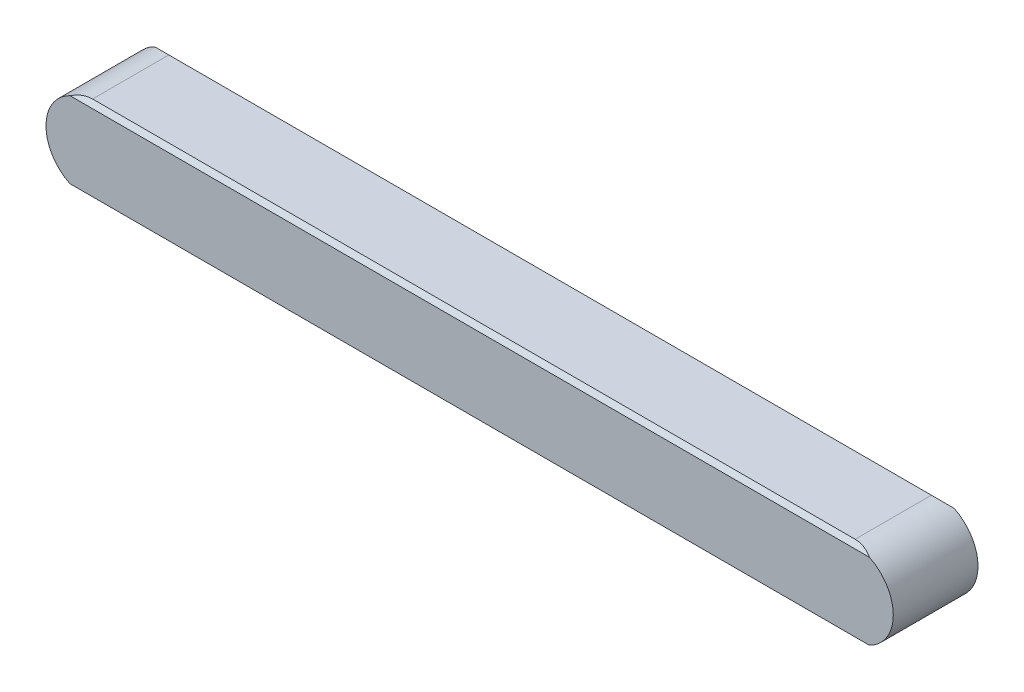
ISO-10303-21;
HEADER;
FILE_DESCRIPTION(('STEP AP214'),'2;1');
FILE_NAME('part.step','',(''),(''),'','','');
FILE_SCHEMA(('AUTOMOTIVE_DESIGN { 1 0 10303 214 1 1 1 1 }'));
ENDSEC;
DATA;
#1=APPLICATION_CONTEXT('core data for automotive mechanical design processes');
#2=APPLICATION_PROTOCOL_DEFINITION('international standard','automotive_design',2000,#1);
#3=PRODUCT_CONTEXT('',#1,'mechanical');
#4=PRODUCT('Part','Part','',(#3));
#5=PRODUCT_RELATED_PRODUCT_CATEGORY('part','',(#4));
#6=PRODUCT_DEFINITION_FORMATION('','',#4);
#7=PRODUCT_DEFINITION_CONTEXT('part definition',#1,'design');
#8=PRODUCT_DEFINITION('design','',#6,#7);
#9=PRODUCT_DEFINITION_SHAPE('','',#8);
#10=(LENGTH_UNIT() NAMED_UNIT(*) SI_UNIT(.MILLI.,.METRE.));
#11=(NAMED_UNIT(*) PLANE_ANGLE_UNIT() SI_UNIT($,.RADIAN.));
#12=(NAMED_UNIT(*) SI_UNIT($,.STERADIAN.) SOLID_ANGLE_UNIT());
#13=UNCERTAINTY_MEASURE_WITH_UNIT(LENGTH_MEASURE(1.E-05),#10,'distance_accuracy_value','');
#14=(GEOMETRIC_REPRESENTATION_CONTEXT(3) GLOBAL_UNCERTAINTY_ASSIGNED_CONTEXT((#13)) GLOBAL_UNIT_ASSIGNED_CONTEXT((#10,
#11,#12)) REPRESENTATION_CONTEXT('',''));
#15=CARTESIAN_POINT('',(0.,0.,0.));
#16=DIRECTION('',(0.,0.,1.));
#17=DIRECTION('',(1.,0.,0.));
#18=AXIS2_PLACEMENT_3D('',#15,#16,#17);
#19=CARTESIAN_POINT('',(2.,2.,4.));
#20=DIRECTION('',(0.,0.,-1.));
#21=DIRECTION('',(1.,0.,0.));
#22=AXIS2_PLACEMENT_3D('',#19,#20,#21);
#23=CYLINDRICAL_SURFACE('',#22,2.);
#24=CARTESIAN_POINT('',(2.,2.,0.));
#25=DIRECTION('',(0.,0.,1.));
#26=DIRECTION('',(1.,0.,0.));
#27=AXIS2_PLACEMENT_3D('',#24,#25,#26);
#28=CIRCLE('',#27,2.);
#29=CARTESIAN_POINT('',(1.12822021129185,3.8,0.));
#30=VERTEX_POINT('',#29);
#31=CARTESIAN_POINT('',(1.12822021129185,0.2,0.));
#32=VERTEX_POINT('',#31);
#33=EDGE_CURVE('E11',#30,#32,#28,.T.);
#34=ORIENTED_EDGE('',*,*,#33,.T.);
#35=CARTESIAN_POINT('',(1.12822021127311,0.200000000009083,-9.0951551845464E-12));
#36=CARTESIAN_POINT('',(1.14505546719256,0.191846182607989,0.008153759645765));
#37=CARTESIAN_POINT('',(1.16208400803007,0.183890606413846,0.0161083509595469));
#38=CARTESIAN_POINT('',(1.19636177545458,0.16846634837534,0.0315298763063802));
#39=CARTESIAN_POINT('',(1.21360763712985,0.160993929256307,0.0390005545594092));
#40=CARTESIAN_POINT('',(1.24830648188129,0.146541873344686,0.0534494313098722));
#41=CARTESIAN_POINT('',(1.26575637210852,0.13955852528189,0.0604313385846773));
#42=CARTESIAN_POINT('',(1.30084902401557,0.126090134213236,0.0738977370397355));
#43=CARTESIAN_POINT('',(1.31848898009063,0.119601434259905,0.080385877883582));
#44=CARTESIAN_POINT('',(1.35394748801855,0.107127426389857,0.0928598685473896));
#45=CARTESIAN_POINT('',(1.37176352827878,0.101138546831902,0.0988492813460164));
#46=CARTESIAN_POINT('',(1.40755974639192,0.0896688415935695,0.110320961105258));
#47=CARTESIAN_POINT('',(1.42553771156546,0.084184562315766,0.115806674866634));
#48=CARTESIAN_POINT('',(1.46164319845094,0.0737282848103385,0.126266128202279));
#49=CARTESIAN_POINT('',(1.47976880710683,0.0687529853990015,0.131243166753974));
#50=CARTESIAN_POINT('',(1.51615488129668,0.0593184544077047,0.140680496272239));
#51=CARTESIAN_POINT('',(1.53441372984083,0.0548561096514326,0.145143904714853));
#52=CARTESIAN_POINT('',(1.57105157897315,0.0464508146472081,0.153549171070533));
#53=CARTESIAN_POINT('',(1.5894292514447,0.0425049781449301,0.157493927816582));
#54=CARTESIAN_POINT('',(1.62628971971653,0.0351356199816959,0.16486037305034));
#55=CARTESIAN_POINT('',(1.64477146904272,0.031709484270154,0.168284679543082));
#56=CARTESIAN_POINT('',(1.68182513057929,0.0253819614153327,0.174608857701596));
#57=CARTESIAN_POINT('',(1.70039625441853,0.0224782661824125,0.177511036072526));
#58=CARTESIAN_POINT('',(1.73761365901591,0.0171976122582754,0.182789596581026));
#59=CARTESIAN_POINT('',(1.75625937981547,0.0148186794803991,0.185167949227452));
#60=CARTESIAN_POINT('',(1.79361094668523,0.0105891048947963,0.189397518893242));
#61=CARTESIAN_POINT('',(1.81231642717336,0.00873684822218577,0.191250347201446));
#62=CARTESIAN_POINT('',(1.84977246141272,0.00556169750289623,0.194427581678641));
#63=CARTESIAN_POINT('',(1.86852280597641,0.00423756982267502,0.195753219268126));
#64=CARTESIAN_POINT('',(1.90605355074672,0.00211945886844322,0.197874686291913));
#65=CARTESIAN_POINT('',(1.92483385659965,0.00132464093373548,0.198671349851647));
#66=CARTESIAN_POINT('',(1.96240941064787,0.000264935059999632,0.199733944778024));
#67=CARTESIAN_POINT('',(1.98120463504602,-3.74241457581229E-07,0.20000029814454));
#68=CARTESIAN_POINT('',(2.,0.,0.199999999999982));
#69=B_SPLINE_CURVE_WITH_KNOTS('',3,(#35,#36,#37,#38,#39,#40,#41,#42,#43,#44,#45,#46,#47,#48,#49,
#50,#51,#52,#53,#54,#55,#56,#57,#58,#59,#60,#61,#62,#63,#64,#65,#66,#67,#68),.UNSPECIFIED.,.F.,
.F.,(4,2,2,2,2,2,2,2,2,2,2,2,2,2,2,2,4),(0.,0.0612153548876154,0.121879837980006,
0.182018269648095,0.241657222285926,0.300825056370281,0.359551949685432,0.417869918602939,
0.475812830300333,0.533416712828984,0.590720491526348,0.647764534838076,0.70459018090659,
0.761239664770041,0.81775603752903,0.874183078090223,0.93056519826967),.UNSPECIFIED.);
#70=CARTESIAN_POINT('',(2.,0.,0.2));
#71=VERTEX_POINT('',#70);
#72=EDGE_CURVE('E25',#32,#71,#69,.T.);
#73=ORIENTED_EDGE('',*,*,#72,.T.);
#74=DIRECTION('',(0.,0.,-1.));
#75=VECTOR('',#74,1.);
#76=CARTESIAN_POINT('',(2.,0.,4.));
#77=LINE('',#76,#75);
#78=CARTESIAN_POINT('',(2.,0.,3.8));
#79=VERTEX_POINT('',#78);
#80=EDGE_CURVE('E292',#79,#71,#77,.T.);
#81=ORIENTED_EDGE('',*,*,#80,.F.);
#82=CARTESIAN_POINT('',(2.,0.,3.80000000000002));
#83=CARTESIAN_POINT('',(1.98120463504602,-3.74241458159707E-07,3.79999970185546));
#84=CARTESIAN_POINT('',(1.96240941064788,0.000264935059999062,3.80026605522198));
#85=CARTESIAN_POINT('',(1.92483385659965,0.0013246409337352,3.80132865014835));
#86=CARTESIAN_POINT('',(1.90605355074672,0.00211945886844324,3.80212531370809));
#87=CARTESIAN_POINT('',(1.86852280597641,0.00423756982267497,3.80424678073187));
#88=CARTESIAN_POINT('',(1.84977246141272,0.00556169750289581,3.80557241832136));
#89=CARTESIAN_POINT('',(1.81231642717336,0.00873684822218532,3.80874965279855));
#90=CARTESIAN_POINT('',(1.79361094668523,0.0105891048947962,3.81060248110676));
#91=CARTESIAN_POINT('',(1.75625937981548,0.0148186794803992,3.81483205077255));
#92=CARTESIAN_POINT('',(1.73761365901591,0.0171976122582754,3.81721040341897));
#93=CARTESIAN_POINT('',(1.70039625441853,0.0224782661824124,3.82248896392747));
#94=CARTESIAN_POINT('',(1.68182513057929,0.0253819614153327,3.8253911422984));
#95=CARTESIAN_POINT('',(1.64477146904272,0.0317094842701541,3.83171532045692));
#96=CARTESIAN_POINT('',(1.62628971971653,0.035135619981696,3.83513962694966));
#97=CARTESIAN_POINT('',(1.5894292514447,0.0425049781449301,3.84250607218342));
#98=CARTESIAN_POINT('',(1.57105157897315,0.0464508146472079,3.84645082892947));
#99=CARTESIAN_POINT('',(1.53441372984083,0.0548561096514324,3.85485609528515));
#100=CARTESIAN_POINT('',(1.51615488129668,0.0593184544077046,3.85931950372776));
#101=CARTESIAN_POINT('',(1.47976880710683,0.0687529853990016,3.86875683324603));
#102=CARTESIAN_POINT('',(1.46164319845094,0.0737282848103387,3.87373387179772));
#103=CARTESIAN_POINT('',(1.42553771156546,0.0841845623157662,3.88419332513337));
#104=CARTESIAN_POINT('',(1.40755974639192,0.0896688415935697,3.88967903889474));
#105=CARTESIAN_POINT('',(1.37176352827878,0.101138546831902,3.90115071865398));
#106=CARTESIAN_POINT('',(1.35394748801854,0.107127426389857,3.90714013145261));
#107=CARTESIAN_POINT('',(1.31848898009063,0.119601434259905,3.91961412211642));
#108=CARTESIAN_POINT('',(1.30084902401557,0.126090134213237,3.92610226296027));
#109=CARTESIAN_POINT('',(1.26575637210852,0.139558525281891,3.93956866141532));
#110=CARTESIAN_POINT('',(1.24830648188129,0.146541873344686,3.94655056869013));
#111=CARTESIAN_POINT('',(1.21360763712985,0.160993929256307,3.96099944544059));
#112=CARTESIAN_POINT('',(1.19636177545458,0.16846634837534,3.96847012369362));
#113=CARTESIAN_POINT('',(1.16208400803006,0.183890606413846,3.98389164904046));
#114=CARTESIAN_POINT('',(1.14505546719255,0.19184618260799,3.99184624035424));
#115=CARTESIAN_POINT('',(1.12822021127311,0.200000000009084,4.0000000000091));
#116=B_SPLINE_CURVE_WITH_KNOTS('',3,(#82,#83,#84,#85,#86,#87,#88,#89,#90,#91,#92,#93,#94,#95,
#96,#97,#98,#99,#100,#101,#102,#103,#104,#105,#106,#107,#108,#109,#110,#111,#112,#113,#114,
#115),.UNSPECIFIED.,.F.,.F.,(4,2,2,2,2,2,2,2,2,2,2,2,2,2,2,2,4),(0.,0.0563821201794471,
0.112809160740642,0.169325533499631,0.225975017363083,0.282800663431597,0.339844706743325,
0.397148485440689,0.45475236796934,0.512695279666735,0.571013248584242,0.629740141899394,
0.688907975983749,0.74854692862158,0.808685360289668,0.86934984338206,0.930565198269677),.UNSPECIFIED.);
#117=CARTESIAN_POINT('',(1.12822021129185,0.2,4.));
#118=VERTEX_POINT('',#117);
#119=EDGE_CURVE('E170',#79,#118,#116,.T.);
#120=ORIENTED_EDGE('',*,*,#119,.T.);
#121=CARTESIAN_POINT('',(2.,2.,4.));
#122=DIRECTION('',(0.,0.,1.));
#123=DIRECTION('',(1.,0.,0.));
#124=AXIS2_PLACEMENT_3D('',#121,#122,#123);
#125=CIRCLE('',#124,2.);
#126=CARTESIAN_POINT('',(1.12822021129185,3.8,4.));
#127=VERTEX_POINT('',#126);
#128=EDGE_CURVE('E278',#127,#118,#125,.T.);
#129=ORIENTED_EDGE('',*,*,#128,.F.);
#130=CARTESIAN_POINT('',(1.12822021127311,3.79999999999092,4.0000000000091));
#131=CARTESIAN_POINT('',(1.14505546719256,3.80815381739201,3.99184624035424));
#132=CARTESIAN_POINT('',(1.16208400803007,3.81610939358615,3.98389164904046));
#133=CARTESIAN_POINT('',(1.19636177545458,3.83153365162466,3.96847012369362));
#134=CARTESIAN_POINT('',(1.21360763712985,3.83900607074369,3.96099944544059));
#135=CARTESIAN_POINT('',(1.24830648188129,3.85345812665531,3.94655056869013));
#136=CARTESIAN_POINT('',(1.26575637210852,3.86044147471811,3.93956866141532));
#137=CARTESIAN_POINT('',(1.30084902401557,3.87390986578676,3.92610226296027));
#138=CARTESIAN_POINT('',(1.31848898009063,3.88039856574009,3.91961412211642));
#139=CARTESIAN_POINT('',(1.35394748801854,3.89287257361014,3.90714013145261));
#140=CARTESIAN_POINT('',(1.37176352827878,3.8988614531681,3.90115071865398));
#141=CARTESIAN_POINT('',(1.40755974639192,3.91033115840643,3.88967903889474));
#142=CARTESIAN_POINT('',(1.42553771156546,3.91581543768423,3.88419332513337));
#143=CARTESIAN_POINT('',(1.46164319845094,3.92627171518966,3.87373387179772));
#144=CARTESIAN_POINT('',(1.47976880710683,3.931247014601,3.86875683324603));
#145=CARTESIAN_POINT('',(1.51615488129668,3.9406815455923,3.85931950372776));
#146=CARTESIAN_POINT('',(1.53441372984083,3.94514389034857,3.85485609528515));
#147=CARTESIAN_POINT('',(1.57105157897315,3.95354918535279,3.84645082892947));
#148=CARTESIAN_POINT('',(1.5894292514447,3.95749502185507,3.84250607218342));
#149=CARTESIAN_POINT('',(1.62628971971653,3.9648643800183,3.83513962694966));
#150=CARTESIAN_POINT('',(1.64477146904272,3.96829051572985,3.83171532045692));
#151=CARTESIAN_POINT('',(1.68182513057929,3.97461803858467,3.8253911422984));
#152=CARTESIAN_POINT('',(1.70039625441853,3.97752173381759,3.82248896392747));
#153=CARTESIAN_POINT('',(1.73761365901591,3.98280238774172,3.81721040341897));
#154=CARTESIAN_POINT('',(1.75625937981547,3.9851813205196,3.81483205077255));
#155=CARTESIAN_POINT('',(1.79361094668523,3.9894108951052,3.81060248110676));
#156=CARTESIAN_POINT('',(1.81231642717336,3.99126315177781,3.80874965279855));
#157=CARTESIAN_POINT('',(1.84977246141272,3.9944383024971,3.80557241832136));
#158=CARTESIAN_POINT('',(1.86852280597641,3.99576243017732,3.80424678073187));
#159=CARTESIAN_POINT('',(1.90605355074672,3.99788054113156,3.80212531370809));
#160=CARTESIAN_POINT('',(1.92483385659965,3.99867535906626,3.80132865014835));
#161=CARTESIAN_POINT('',(1.96240941064788,3.99973506494,3.80026605522198));
#162=CARTESIAN_POINT('',(1.98120463504602,4.00000037424146,3.79999970185546));
#163=CARTESIAN_POINT('',(2.,4.,3.80000000000002));
#164=B_SPLINE_CURVE_WITH_KNOTS('',3,(#130,#131,#132,#133,#134,#135,#136,#137,#138,#139,#140,
#141,#142,#143,#144,#145,#146,#147,#148,#149,#150,#151,#152,#153,#154,#155,#156,#157,#158,#159,
#160,#161,#162,#163),.UNSPECIFIED.,.F.,.F.,(4,2,2,2,2,2,2,2,2,2,2,2,2,2,2,2,4),(0.,
0.0612153548876149,0.121879837980007,0.182018269648093,0.241657222285924,0.30082505637028,
0.359551949685432,0.417869918602939,0.475812830300334,0.533416712828984,0.590720491526348,
0.647764534838076,0.704590180906591,0.761239664770041,0.817756037529032,0.874183078090227,
0.930565198269674),.UNSPECIFIED.);
#165=CARTESIAN_POINT('',(2.,4.,3.8));
#166=VERTEX_POINT('',#165);
#167=EDGE_CURVE('E266',#127,#166,#164,.T.);
#168=ORIENTED_EDGE('',*,*,#167,.T.);
#169=DIRECTION('',(0.,0.,-1.));
#170=VECTOR('',#169,1.);
#171=CARTESIAN_POINT('',(2.,4.,4.));
#172=LINE('',#171,#170);
#173=CARTESIAN_POINT('',(2.,4.,0.2));
#174=VERTEX_POINT('',#173);
#175=EDGE_CURVE('E99',#166,#174,#172,.T.);
#176=ORIENTED_EDGE('',*,*,#175,.T.);
#177=CARTESIAN_POINT('',(2.,4.,0.199999999999982));
#178=CARTESIAN_POINT('',(1.98120463504602,4.00000037424146,0.200000298144541));
#179=CARTESIAN_POINT('',(1.96240941064788,3.99973506494,0.199733944778025));
#180=CARTESIAN_POINT('',(1.92483385659965,3.99867535906626,0.198671349851646));
#181=CARTESIAN_POINT('',(1.90605355074673,3.99788054113156,0.197874686291912));
#182=CARTESIAN_POINT('',(1.86852280597641,3.99576243017732,0.195753219268125));
#183=CARTESIAN_POINT('',(1.84977246141272,3.9944383024971,0.194427581678641));
#184=CARTESIAN_POINT('',(1.81231642717336,3.99126315177781,0.191250347201447));
#185=CARTESIAN_POINT('',(1.79361094668523,3.9894108951052,0.189397518893242));
#186=CARTESIAN_POINT('',(1.75625937981548,3.9851813205196,0.185167949227452));
#187=CARTESIAN_POINT('',(1.73761365901592,3.98280238774172,0.182789596581026));
#188=CARTESIAN_POINT('',(1.70039625441853,3.97752173381759,0.177511036072526));
#189=CARTESIAN_POINT('',(1.68182513057929,3.97461803858467,0.174608857701596));
#190=CARTESIAN_POINT('',(1.64477146904272,3.96829051572985,0.168284679543081));
#191=CARTESIAN_POINT('',(1.62628971971653,3.9648643800183,0.16486037305034));
#192=CARTESIAN_POINT('',(1.5894292514447,3.95749502185507,0.157493927816582));
#193=CARTESIAN_POINT('',(1.57105157897315,3.95354918535279,0.153549171070533));
#194=CARTESIAN_POINT('',(1.53441372984083,3.94514389034857,0.145143904714853));
#195=CARTESIAN_POINT('',(1.51615488129668,3.9406815455923,0.140680496272239));
#196=CARTESIAN_POINT('',(1.47976880710683,3.931247014601,0.131243166753974));
#197=CARTESIAN_POINT('',(1.46164319845094,3.92627171518966,0.126266128202278));
#198=CARTESIAN_POINT('',(1.42553771156546,3.91581543768423,0.115806674866633));
#199=CARTESIAN_POINT('',(1.40755974639192,3.91033115840643,0.110320961105257));
#200=CARTESIAN_POINT('',(1.37176352827878,3.8988614531681,0.0988492813460153));
#201=CARTESIAN_POINT('',(1.35394748801854,3.89287257361014,0.0928598685473885));
#202=CARTESIAN_POINT('',(1.31848898009063,3.88039856574009,0.08038587788358));
#203=CARTESIAN_POINT('',(1.30084902401557,3.87390986578676,0.0738977370397325));
#204=CARTESIAN_POINT('',(1.26575637210852,3.86044147471811,0.0604313385846745));
#205=CARTESIAN_POINT('',(1.24830648188129,3.85345812665531,0.0534494313098706));
#206=CARTESIAN_POINT('',(1.21360763712985,3.83900607074369,0.0390005545594077));
#207=CARTESIAN_POINT('',(1.19636177545458,3.83153365162466,0.0315298763063775));
#208=CARTESIAN_POINT('',(1.16208400803007,3.81610939358615,0.0161083509595426));
#209=CARTESIAN_POINT('',(1.14505546719256,3.80815381739201,0.00815375964576015));
#210=CARTESIAN_POINT('',(1.12822021127311,3.79999999999092,-9.09862463149835E-12));
#211=B_SPLINE_CURVE_WITH_KNOTS('',3,(#177,#178,#179,#180,#181,#182,#183,#184,#185,#186,#187,
#188,#189,#190,#191,#192,#193,#194,#195,#196,#197,#198,#199,#200,#201,#202,#203,#204,#205,#206,
#207,#208,#209,#210),.UNSPECIFIED.,.F.,.F.,(4,2,2,2,2,2,2,2,2,2,2,2,2,2,2,2,4),(0.,
0.0563821201794484,0.11280916074064,0.169325533499633,0.225975017363082,0.282800663431596,
0.339844706743324,0.397148485440688,0.45475236796934,0.512695279666735,0.571013248584244,
0.629740141899394,0.68890797598375,0.748546928621578,0.808685360289669,0.86934984338206,
0.930565198269675),.UNSPECIFIED.);
#212=EDGE_CURVE('E253',#174,#30,#211,.T.);
#213=ORIENTED_EDGE('',*,*,#212,.T.);
#214=EDGE_LOOP('',(#34,#73,#81,#120,#129,#168,#176,#213));
#215=FACE_BOUND('',#214,.T.);
#216=ADVANCED_FACE('F16',(#215),#23,.T.);
#217=CARTESIAN_POINT('',(40.,3.8,0.));
#218=DIRECTION('',(0.,-0.707106781186548,0.707106781186548));
#219=DIRECTION('',(0.,-0.707106781186548,-0.707106781186548));
#220=AXIS2_PLACEMENT_3D('',#217,#218,#219);
#221=PLANE('',#220);
#222=DIRECTION('',(-1.,0.,0.));
#223=VECTOR('',#222,1.);
#224=CARTESIAN_POINT('',(40.,4.,0.2));
#225=LINE('',#224,#223);
#226=CARTESIAN_POINT('',(38.,4.,0.2));
#227=VERTEX_POINT('',#226);
#228=EDGE_CURVE('E251',#227,#174,#225,.T.);
#229=ORIENTED_EDGE('',*,*,#228,.F.);
#230=CARTESIAN_POINT('',(38.8717797887268,3.79999999999098,-9.02229679855537E-12));
#231=CARTESIAN_POINT('',(38.8549445328074,3.80815381739207,0.00815375964583487));
#232=CARTESIAN_POINT('',(38.8379159919698,3.81610939358621,0.0161083509596151));
#233=CARTESIAN_POINT('',(38.8036382245453,3.83153365162472,0.0315298763064452));
#234=CARTESIAN_POINT('',(38.7863923628701,3.83900607074375,0.0390005545594728));
#235=CARTESIAN_POINT('',(38.7516935181186,3.85345812665536,0.0534494313099315));
#236=CARTESIAN_POINT('',(38.7342436278914,3.86044147471816,0.0604313385847339));
#237=CARTESIAN_POINT('',(38.6991509759844,3.87390986578681,0.0738977370397886));
#238=CARTESIAN_POINT('',(38.6815110199093,3.88039856574014,0.0803858778836343));
#239=CARTESIAN_POINT('',(38.6460525119814,3.89287257361018,0.0928598685474383));
#240=CARTESIAN_POINT('',(38.6282364717212,3.89886145316813,0.0988492813460623));
#241=CARTESIAN_POINT('',(38.592440253608,3.91033115840646,0.110320961105301));
#242=CARTESIAN_POINT('',(38.5744622884345,3.91581543768426,0.115806674866677));
#243=CARTESIAN_POINT('',(38.538356801549,3.92627171518969,0.126266128202319));
#244=CARTESIAN_POINT('',(38.5202311928931,3.93124701460102,0.131243166754012));
#245=CARTESIAN_POINT('',(38.4838451187033,3.94068154559232,0.140680496272275));
#246=CARTESIAN_POINT('',(38.4655862701591,3.94514389034859,0.145143904714888));
#247=CARTESIAN_POINT('',(38.4289484210268,3.95354918535281,0.153549171070566));
#248=CARTESIAN_POINT('',(38.4105707485553,3.95749502185509,0.157493927816614));
#249=CARTESIAN_POINT('',(38.3737102802834,3.96486438001832,0.16486037305037));
#250=CARTESIAN_POINT('',(38.3552285309572,3.96829051572986,0.16828467954311));
#251=CARTESIAN_POINT('',(38.3181748694207,3.97461803858468,0.174608857701623));
#252=CARTESIAN_POINT('',(38.2996037455814,3.9775217338176,0.177511036072552));
#253=CARTESIAN_POINT('',(38.2623863409841,3.98280238774173,0.182789596581051));
#254=CARTESIAN_POINT('',(38.2437406201845,3.98518132051961,0.185167949227477));
#255=CARTESIAN_POINT('',(38.2063890533148,3.98941089510521,0.189397518893266));
#256=CARTESIAN_POINT('',(38.1876835728266,3.99126315177782,0.19125034720147));
#257=CARTESIAN_POINT('',(38.1502275385873,3.99443830249711,0.194427581678664));
#258=CARTESIAN_POINT('',(38.1314771940236,3.99576243017733,0.195753219268148));
#259=CARTESIAN_POINT('',(38.0939464492533,3.99788054113156,0.197874686291935));
#260=CARTESIAN_POINT('',(38.0751661434003,3.99867535906627,0.198671349851669));
#261=CARTESIAN_POINT('',(38.0375905893521,3.99973506494001,0.199733944778047));
#262=CARTESIAN_POINT('',(38.018795364954,4.00000037424146,0.200000298144563));
#263=CARTESIAN_POINT('',(38.,4.00000000000001,0.200000000000004));
#264=B_SPLINE_CURVE_WITH_KNOTS('',3,(#230,#231,#232,#233,#234,#235,#236,#237,#238,#239,#240,
#241,#242,#243,#244,#245,#246,#247,#248,#249,#250,#251,#252,#253,#254,#255,#256,#257,#258,#259,
#260,#261,#262,#263),.UNSPECIFIED.,.F.,.F.,(4,2,2,2,2,2,2,2,2,2,2,2,2,2,2,2,4),(0.,
0.0612153548876101,0.121879837979992,0.18201826964807,0.241657222285893,0.300825056370243,
0.359551949685387,0.417869918602887,0.475812830300271,0.533416712828921,0.590720491526278,
0.647764534837997,0.704590180906501,0.761239664769946,0.817756037528934,0.87418307809012,
0.930565198269562),.UNSPECIFIED.);
#265=CARTESIAN_POINT('',(38.871779788708,3.8,0.));
#266=VERTEX_POINT('',#265);
#267=EDGE_CURVE('E89',#266,#227,#264,.T.);
#268=ORIENTED_EDGE('',*,*,#267,.F.);
#269=DIRECTION('',(-1.,0.,0.));
#270=VECTOR('',#269,1.);
#271=CARTESIAN_POINT('',(40.,3.8,0.));
#272=LINE('',#271,#270);
#273=EDGE_CURVE('E220',#266,#30,#272,.T.);
#274=ORIENTED_EDGE('',*,*,#273,.T.);
#275=ORIENTED_EDGE('',*,*,#212,.F.);
#276=EDGE_LOOP('',(#229,#268,#274,#275));
#277=FACE_BOUND('',#276,.T.);
#278=ADVANCED_FACE('F228',(#277),#221,.F.);
#279=CARTESIAN_POINT('',(2.,2.,0.));
#280=DIRECTION('',(0.,0.,1.));
#281=DIRECTION('',(1.,0.,0.));
#282=AXIS2_PLACEMENT_3D('',#279,#280,#281);
#283=PLANE('',#282);
#284=ORIENTED_EDGE('',*,*,#33,.F.);
#285=ORIENTED_EDGE('',*,*,#273,.F.);
#286=CARTESIAN_POINT('',(38.,1.99999999999984,0.));
#287=DIRECTION('',(0.,0.,1.));
#288=DIRECTION('',(1.,0.,0.));
#289=AXIS2_PLACEMENT_3D('',#286,#287,#288);
#290=CIRCLE('',#289,2.00000000000016);
#291=CARTESIAN_POINT('',(38.871779788708,0.2,0.));
#292=VERTEX_POINT('',#291);
#293=EDGE_CURVE('E216',#292,#266,#290,.T.);
#294=ORIENTED_EDGE('',*,*,#293,.F.);
#295=DIRECTION('',(-1.,0.,0.));
#296=VECTOR('',#295,1.);
#297=CARTESIAN_POINT('',(40.,0.2,0.));
#298=LINE('',#297,#296);
#299=EDGE_CURVE('E214',#292,#32,#298,.T.);
#300=ORIENTED_EDGE('',*,*,#299,.T.);
#301=EDGE_LOOP('',(#284,#285,#294,#300));
#302=FACE_BOUND('',#301,.T.);
#303=ADVANCED_FACE('F199',(#302),#283,.F.);
#304=CARTESIAN_POINT('',(40.,0.,0.2));
#305=DIRECTION('',(0.,0.707106781186548,0.707106781186548));
#306=DIRECTION('',(0.,-0.707106781186548,0.707106781186548));
#307=AXIS2_PLACEMENT_3D('',#304,#305,#306);
#308=PLANE('',#307);
#309=ORIENTED_EDGE('',*,*,#299,.F.);
#310=CARTESIAN_POINT('',(38.,-3.15285991758785E-13,0.199999999999999));
#311=CARTESIAN_POINT('',(38.018795364954,-3.74241773038521E-07,0.200000298144557));
#312=CARTESIAN_POINT('',(38.0375905893521,0.000264935059684064,0.199733944778041));
#313=CARTESIAN_POINT('',(38.0751661434003,0.00132464093341972,0.198671349851664));
#314=CARTESIAN_POINT('',(38.0939464492533,0.0021194588681275,0.19787468629193));
#315=CARTESIAN_POINT('',(38.1314771940236,0.0042375698223593,0.195753219268144));
#316=CARTESIAN_POINT('',(38.1502275385873,0.00556169750258049,0.19442758167866));
#317=CARTESIAN_POINT('',(38.1876835728266,0.00873684822187012,0.191250347201466));
#318=CARTESIAN_POINT('',(38.2063890533148,0.0105891048944807,0.189397518893262));
#319=CARTESIAN_POINT('',(38.2437406201845,0.0148186794800838,0.185167949227473));
#320=CARTESIAN_POINT('',(38.2623863409841,0.0171976122579604,0.182789596581047));
#321=CARTESIAN_POINT('',(38.2996037455815,0.0224782661820979,0.177511036072548));
#322=CARTESIAN_POINT('',(38.3181748694207,0.0253819614150184,0.17460885770162));
#323=CARTESIAN_POINT('',(38.3552285309573,0.0317094842698401,0.168284679543107));
#324=CARTESIAN_POINT('',(38.3737102802835,0.0351356199813819,0.164860373050367));
#325=CARTESIAN_POINT('',(38.4105707485553,0.0425049781446157,0.157493927816611));
#326=CARTESIAN_POINT('',(38.4289484210269,0.0464508146468933,0.153549171070562));
#327=CARTESIAN_POINT('',(38.4655862701592,0.0548561096511171,0.145143904714885));
#328=CARTESIAN_POINT('',(38.4838451187033,0.0593184544073888,0.140680496272272));
#329=CARTESIAN_POINT('',(38.5202311928932,0.068752985398685,0.13124316675401));
#330=CARTESIAN_POINT('',(38.5383568015491,0.0737282848100218,0.126266128202316));
#331=CARTESIAN_POINT('',(38.5744622884346,0.0841845623154494,0.115806674866674));
#332=CARTESIAN_POINT('',(38.5924402536081,0.0896688415932531,0.110320961105299));
#333=CARTESIAN_POINT('',(38.6282364717212,0.101138546831586,0.0988492813460611));
#334=CARTESIAN_POINT('',(38.6460525119815,0.107127426389541,0.0928598685474373));
#335=CARTESIAN_POINT('',(38.6815110199094,0.119601434259589,0.0803858778836325));
#336=CARTESIAN_POINT('',(38.6991509759845,0.12609013421292,0.073897737039786));
#337=CARTESIAN_POINT('',(38.7342436278915,0.139558525281575,0.0604313385847313));
#338=CARTESIAN_POINT('',(38.7516935181187,0.146541873344371,0.0534494313099296));
#339=CARTESIAN_POINT('',(38.7863923628702,0.160993929255992,0.0390005545594712));
#340=CARTESIAN_POINT('',(38.8036382245455,0.168466348375024,0.0315298763064431));
#341=CARTESIAN_POINT('',(38.83791599197,0.183890606413528,0.0161083509596129));
#342=CARTESIAN_POINT('',(38.8549445328075,0.19184618260767,0.00815375964583311));
#343=CARTESIAN_POINT('',(38.8717797887269,0.200000000008764,-9.02316416029336E-12));
#344=B_SPLINE_CURVE_WITH_KNOTS('',3,(#310,#311,#312,#313,#314,#315,#316,#317,#318,#319,#320,
#321,#322,#323,#324,#325,#326,#327,#328,#329,#330,#331,#332,#333,#334,#335,#336,#337,#338,#339,
#340,#341,#342,#343),.UNSPECIFIED.,.F.,.F.,(4,2,2,2,2,2,2,2,2,2,2,2,2,2,2,2,4),(0.,
0.0563821201794414,0.112809160740641,0.169325533499636,0.225975017363096,0.282800663431613,
0.339844706743346,0.39714848544071,0.454752367969355,0.512695279666745,0.571013248584253,
0.629740141899404,0.688907975983769,0.7485469286216,0.808685360289686,0.869349843382077,
0.930565198269687),.UNSPECIFIED.);
#345=CARTESIAN_POINT('',(38.,0.,0.2));
#346=VERTEX_POINT('',#345);
#347=EDGE_CURVE('E147',#346,#292,#344,.T.);
#348=ORIENTED_EDGE('',*,*,#347,.F.);
#349=DIRECTION('',(-1.,0.,0.));
#350=VECTOR('',#349,1.);
#351=CARTESIAN_POINT('',(40.,0.,0.2));
#352=LINE('',#351,#350);
#353=EDGE_CURVE('E175',#346,#71,#352,.T.);
#354=ORIENTED_EDGE('',*,*,#353,.T.);
#355=ORIENTED_EDGE('',*,*,#72,.F.);
#356=EDGE_LOOP('',(#309,#348,#354,#355));
#357=FACE_BOUND('',#356,.T.);
#358=ADVANCED_FACE('F188',(#357),#308,.F.);
#359=CARTESIAN_POINT('',(2.,0.,4.));
#360=DIRECTION('',(0.,1.,0.));
#361=DIRECTION('',(0.,0.,1.));
#362=AXIS2_PLACEMENT_3D('',#359,#360,#361);
#363=PLANE('',#362);
#364=ORIENTED_EDGE('',*,*,#80,.T.);
#365=ORIENTED_EDGE('',*,*,#353,.F.);
#366=DIRECTION('',(0.,0.,-1.));
#367=VECTOR('',#366,1.);
#368=CARTESIAN_POINT('',(38.,0.,4.));
#369=LINE('',#368,#367);
#370=CARTESIAN_POINT('',(38.,0.,3.8));
#371=VERTEX_POINT('',#370);
#372=EDGE_CURVE('E159',#371,#346,#369,.T.);
#373=ORIENTED_EDGE('',*,*,#372,.F.);
#374=DIRECTION('',(-1.,0.,0.));
#375=VECTOR('',#374,1.);
#376=CARTESIAN_POINT('',(40.,0.,3.8));
#377=LINE('',#376,#375);
#378=EDGE_CURVE('E165',#371,#79,#377,.T.);
#379=ORIENTED_EDGE('',*,*,#378,.T.);
#380=EDGE_LOOP('',(#364,#365,#373,#379));
#381=FACE_BOUND('',#380,.T.);
#382=ADVANCED_FACE('F198',(#381),#363,.F.);
#383=CARTESIAN_POINT('',(40.,0.2,4.));
#384=DIRECTION('',(0.,0.707106781186548,-0.707106781186548));
#385=DIRECTION('',(0.,0.707106781186548,0.707106781186548));
#386=AXIS2_PLACEMENT_3D('',#383,#384,#385);
#387=PLANE('',#386);
#388=ORIENTED_EDGE('',*,*,#378,.F.);
#389=CARTESIAN_POINT('',(38.8717797887269,0.200000000008767,4.00000000000902));
#390=CARTESIAN_POINT('',(38.8549445328075,0.191846182607673,3.99184624035416));
#391=CARTESIAN_POINT('',(38.83791599197,0.18389060641353,3.98389164904038));
#392=CARTESIAN_POINT('',(38.8036382245455,0.168466348375025,3.96847012369356));
#393=CARTESIAN_POINT('',(38.7863923628702,0.160993929255992,3.96099944544053));
#394=CARTESIAN_POINT('',(38.7516935181187,0.146541873344371,3.94655056869007));
#395=CARTESIAN_POINT('',(38.7342436278915,0.139558525281576,3.93956866141527));
#396=CARTESIAN_POINT('',(38.6991509759845,0.126090134212921,3.92610226296021));
#397=CARTESIAN_POINT('',(38.6815110199094,0.11960143425959,3.91961412211637));
#398=CARTESIAN_POINT('',(38.6460525119815,0.107127426389541,3.90714013145256));
#399=CARTESIAN_POINT('',(38.6282364717212,0.101138546831586,3.90115071865394));
#400=CARTESIAN_POINT('',(38.5924402536081,0.0896688415932525,3.8896790388947));
#401=CARTESIAN_POINT('',(38.5744622884346,0.0841845623154494,3.88419332513332));
#402=CARTESIAN_POINT('',(38.5383568015491,0.0737282848100224,3.87373387179768));
#403=CARTESIAN_POINT('',(38.5202311928932,0.0687529853986854,3.86875683324599));
#404=CARTESIAN_POINT('',(38.4838451187033,0.0593184544073889,3.85931950372773));
#405=CARTESIAN_POINT('',(38.4655862701592,0.0548561096511169,3.85485609528511));
#406=CARTESIAN_POINT('',(38.4289484210269,0.0464508146468934,3.84645082892944));
#407=CARTESIAN_POINT('',(38.4105707485553,0.0425049781446163,3.84250607218339));
#408=CARTESIAN_POINT('',(38.3737102802835,0.0351356199813826,3.83513962694963));
#409=CARTESIAN_POINT('',(38.3552285309573,0.0317094842698402,3.83171532045689));
#410=CARTESIAN_POINT('',(38.3181748694207,0.0253819614150184,3.82539114229838));
#411=CARTESIAN_POINT('',(38.2996037455815,0.0224782661820983,3.82248896392745));
#412=CARTESIAN_POINT('',(38.2623863409841,0.0171976122579608,3.81721040341895));
#413=CARTESIAN_POINT('',(38.2437406201845,0.014818679480084,3.81483205077253));
#414=CARTESIAN_POINT('',(38.2063890533148,0.0105891048944806,3.81060248110674));
#415=CARTESIAN_POINT('',(38.1876835728266,0.00873684822186997,3.80874965279853));
#416=CARTESIAN_POINT('',(38.1502275385873,0.00556169750258064,3.80557241832134));
#417=CARTESIAN_POINT('',(38.1314771940236,0.00423756982235977,3.80424678073186));
#418=CARTESIAN_POINT('',(38.0939464492533,0.00211945886812803,3.80212531370807));
#419=CARTESIAN_POINT('',(38.0751661434003,0.00132464093341995,3.80132865014834));
#420=CARTESIAN_POINT('',(38.0375905893521,0.000264935059683769,3.80026605522196));
#421=CARTESIAN_POINT('',(38.018795364954,-3.74241773491809E-07,3.79999970185544));
#422=CARTESIAN_POINT('',(38.,-3.15285991758785E-13,3.8));
#423=B_SPLINE_CURVE_WITH_KNOTS('',3,(#389,#390,#391,#392,#393,#394,#395,#396,#397,#398,#399,
#400,#401,#402,#403,#404,#405,#406,#407,#408,#409,#410,#411,#412,#413,#414,#415,#416,#417,#418,
#419,#420,#421,#422),.UNSPECIFIED.,.F.,.F.,(4,2,2,2,2,2,2,2,2,2,2,2,2,2,2,2,4),(0.,
0.0612153548876116,0.121879837980002,0.182018269648089,0.241657222285925,0.300825056370278,
0.359551949685435,0.417869918602943,0.475812830300327,0.533416712828978,0.590720491526342,
0.647764534838075,0.704590180906593,0.761239664770052,0.817756037529047,0.87418307809024,
0.930565198269681),.UNSPECIFIED.);
#424=CARTESIAN_POINT('',(38.871779788708,0.2,4.));
#425=VERTEX_POINT('',#424);
#426=EDGE_CURVE('E157',#425,#371,#423,.T.);
#427=ORIENTED_EDGE('',*,*,#426,.F.);
#428=DIRECTION('',(-1.,0.,0.));
#429=VECTOR('',#428,1.);
#430=CARTESIAN_POINT('',(40.,0.2,4.));
#431=LINE('',#430,#429);
#432=EDGE_CURVE('E166',#425,#118,#431,.T.);
#433=ORIENTED_EDGE('',*,*,#432,.T.);
#434=ORIENTED_EDGE('',*,*,#119,.F.);
#435=EDGE_LOOP('',(#388,#427,#433,#434));
#436=FACE_BOUND('',#435,.T.);
#437=ADVANCED_FACE('F169',(#436),#387,.F.);
#438=CARTESIAN_POINT('',(2.,2.,4.));
#439=DIRECTION('',(0.,0.,1.));
#440=DIRECTION('',(1.,0.,0.));
#441=AXIS2_PLACEMENT_3D('',#438,#439,#440);
#442=PLANE('',#441);
#443=DIRECTION('',(-1.,0.,0.));
#444=VECTOR('',#443,1.);
#445=CARTESIAN_POINT('',(40.,3.8,4.));
#446=LINE('',#445,#444);
#447=CARTESIAN_POINT('',(38.871779788708,3.8,4.));
#448=VERTEX_POINT('',#447);
#449=EDGE_CURVE('E106',#448,#127,#446,.T.);
#450=ORIENTED_EDGE('',*,*,#449,.T.);
#451=ORIENTED_EDGE('',*,*,#128,.T.);
#452=ORIENTED_EDGE('',*,*,#432,.F.);
#453=CARTESIAN_POINT('',(38.,2.00000000000016,4.));
#454=DIRECTION('',(0.,0.,1.));
#455=DIRECTION('',(1.,0.,0.));
#456=AXIS2_PLACEMENT_3D('',#453,#454,#455);
#457=CIRCLE('',#456,2.00000000000016);
#458=EDGE_CURVE('E93',#425,#448,#457,.T.);
#459=ORIENTED_EDGE('',*,*,#458,.T.);
#460=EDGE_LOOP('',(#450,#451,#452,#459));
#461=FACE_BOUND('',#460,.T.);
#462=ADVANCED_FACE('F125',(#461),#442,.T.);
#463=CARTESIAN_POINT('',(38.,1.99999999999984,4.));
#464=DIRECTION('',(0.,0.,-1.));
#465=DIRECTION('',(-1.,0.,0.));
#466=AXIS2_PLACEMENT_3D('',#463,#464,#465);
#467=CYLINDRICAL_SURFACE('',#466,2.00000000000016);
#468=DIRECTION('',(0.,0.,-1.));
#469=VECTOR('',#468,1.);
#470=CARTESIAN_POINT('',(38.,4.,4.));
#471=LINE('',#470,#469);
#472=CARTESIAN_POINT('',(38.,4.,3.8));
#473=VERTEX_POINT('',#472);
#474=EDGE_CURVE('E80',#473,#227,#471,.T.);
#475=ORIENTED_EDGE('',*,*,#474,.F.);
#476=CARTESIAN_POINT('',(38.,4.00000000000001,3.8));
#477=CARTESIAN_POINT('',(38.018795364954,4.00000037424146,3.79999970185544));
#478=CARTESIAN_POINT('',(38.0375905893521,3.99973506494001,3.80026605522195));
#479=CARTESIAN_POINT('',(38.0751661434003,3.99867535906627,3.80132865014833));
#480=CARTESIAN_POINT('',(38.0939464492533,3.99788054113156,3.80212531370807));
#481=CARTESIAN_POINT('',(38.1314771940236,3.99576243017733,3.80424678073185));
#482=CARTESIAN_POINT('',(38.1502275385873,3.99443830249711,3.80557241832134));
#483=CARTESIAN_POINT('',(38.1876835728266,3.99126315177782,3.80874965279853));
#484=CARTESIAN_POINT('',(38.2063890533148,3.98941089510521,3.81060248110673));
#485=CARTESIAN_POINT('',(38.2437406201845,3.98518132051961,3.81483205077252));
#486=CARTESIAN_POINT('',(38.2623863409841,3.98280238774173,3.81721040341895));
#487=CARTESIAN_POINT('',(38.2996037455814,3.9775217338176,3.82248896392745));
#488=CARTESIAN_POINT('',(38.3181748694207,3.97461803858468,3.82539114229838));
#489=CARTESIAN_POINT('',(38.3552285309572,3.96829051572986,3.83171532045689));
#490=CARTESIAN_POINT('',(38.3737102802834,3.96486438001832,3.83513962694963));
#491=CARTESIAN_POINT('',(38.4105707485553,3.95749502185509,3.84250607218339));
#492=CARTESIAN_POINT('',(38.4289484210268,3.95354918535281,3.84645082892943));
#493=CARTESIAN_POINT('',(38.4655862701591,3.94514389034859,3.85485609528511));
#494=CARTESIAN_POINT('',(38.4838451187033,3.94068154559232,3.85931950372773));
#495=CARTESIAN_POINT('',(38.5202311928931,3.93124701460102,3.86875683324599));
#496=CARTESIAN_POINT('',(38.538356801549,3.92627171518969,3.87373387179768));
#497=CARTESIAN_POINT('',(38.5744622884345,3.91581543768426,3.88419332513332));
#498=CARTESIAN_POINT('',(38.592440253608,3.91033115840646,3.8896790388947));
#499=CARTESIAN_POINT('',(38.6282364717212,3.89886145316813,3.90115071865394));
#500=CARTESIAN_POINT('',(38.6460525119814,3.89287257361018,3.90714013145256));
#501=CARTESIAN_POINT('',(38.6815110199093,3.88039856574014,3.91961412211637));
#502=CARTESIAN_POINT('',(38.6991509759844,3.87390986578681,3.92610226296021));
#503=CARTESIAN_POINT('',(38.7342436278914,3.86044147471816,3.93956866141527));
#504=CARTESIAN_POINT('',(38.7516935181186,3.85345812665536,3.94655056869007));
#505=CARTESIAN_POINT('',(38.7863923628701,3.83900607074375,3.96099944544053));
#506=CARTESIAN_POINT('',(38.8036382245453,3.83153365162472,3.96847012369356));
#507=CARTESIAN_POINT('',(38.8379159919698,3.81610939358621,3.98389164904039));
#508=CARTESIAN_POINT('',(38.8549445328074,3.80815381739207,3.99184624035417));
#509=CARTESIAN_POINT('',(38.8717797887268,3.79999999999098,4.00000000000902));
#510=B_SPLINE_CURVE_WITH_KNOTS('',3,(#476,#477,#478,#479,#480,#481,#482,#483,#484,#485,#486,
#487,#488,#489,#490,#491,#492,#493,#494,#495,#496,#497,#498,#499,#500,#501,#502,#503,#504,#505,
#506,#507,#508,#509),.UNSPECIFIED.,.F.,.F.,(4,2,2,2,2,2,2,2,2,2,2,2,2,2,2,2,4),(0.,
0.0563821201794414,0.112809160740627,0.169325533499615,0.225975017363061,0.282800663431564,
0.339844706743284,0.39714848544064,0.454752367969291,0.512695279666674,0.571013248584175,
0.629740141899318,0.688907975983668,0.748546928621491,0.808685360289569,0.869349843381952,
0.930565198269561),.UNSPECIFIED.);
#511=EDGE_CURVE('E85',#473,#448,#510,.T.);
#512=ORIENTED_EDGE('',*,*,#511,.T.);
#513=ORIENTED_EDGE('',*,*,#458,.F.);
#514=ORIENTED_EDGE('',*,*,#426,.T.);
#515=ORIENTED_EDGE('',*,*,#372,.T.);
#516=ORIENTED_EDGE('',*,*,#347,.T.);
#517=ORIENTED_EDGE('',*,*,#293,.T.);
#518=ORIENTED_EDGE('',*,*,#267,.T.);
#519=EDGE_LOOP('',(#475,#512,#513,#514,#515,#516,#517,#518));
#520=FACE_BOUND('',#519,.T.);
#521=ADVANCED_FACE('F82',(#520),#467,.T.);
#522=CARTESIAN_POINT('',(40.,4.,3.8));
#523=DIRECTION('',(0.,-0.707106781186548,-0.707106781186548));
#524=DIRECTION('',(0.,0.707106781186548,-0.707106781186548));
#525=AXIS2_PLACEMENT_3D('',#522,#523,#524);
#526=PLANE('',#525);
#527=ORIENTED_EDGE('',*,*,#449,.F.);
#528=ORIENTED_EDGE('',*,*,#511,.F.);
#529=DIRECTION('',(-1.,0.,0.));
#530=VECTOR('',#529,1.);
#531=CARTESIAN_POINT('',(40.,4.,3.8));
#532=LINE('',#531,#530);
#533=EDGE_CURVE('E97',#473,#166,#532,.T.);
#534=ORIENTED_EDGE('',*,*,#533,.T.);
#535=ORIENTED_EDGE('',*,*,#167,.F.);
#536=EDGE_LOOP('',(#527,#528,#534,#535));
#537=FACE_BOUND('',#536,.T.);
#538=ADVANCED_FACE('F104',(#537),#526,.F.);
#539=CARTESIAN_POINT('',(38.,4.,4.));
#540=DIRECTION('',(0.,-1.,0.));
#541=DIRECTION('',(0.,0.,-1.));
#542=AXIS2_PLACEMENT_3D('',#539,#540,#541);
#543=PLANE('',#542);
#544=ORIENTED_EDGE('',*,*,#175,.F.);
#545=ORIENTED_EDGE('',*,*,#533,.F.);
#546=ORIENTED_EDGE('',*,*,#474,.T.);
#547=ORIENTED_EDGE('',*,*,#228,.T.);
#548=EDGE_LOOP('',(#544,#545,#546,#547));
#549=FACE_BOUND('',#548,.T.);
#550=ADVANCED_FACE('F98',(#549),#543,.F.);
#551=CLOSED_SHELL('',(#216,#278,#303,#358,#382,#437,#462,#521,#538,#550));
#552=MANIFOLD_SOLID_BREP('B1',#551);
#553=ADVANCED_BREP_SHAPE_REPRESENTATION('',(#18,#552),#14);
#554=SHAPE_DEFINITION_REPRESENTATION(#9,#553);
ENDSEC;
END-ISO-10303-21;
